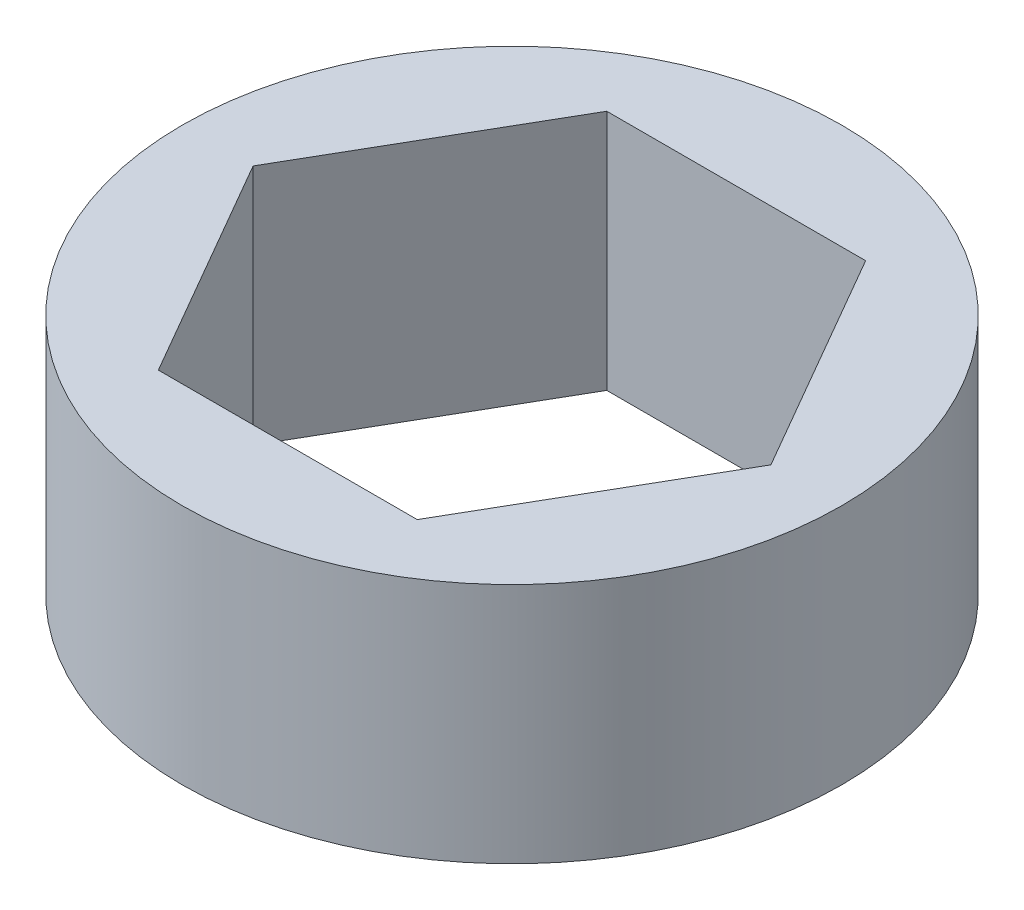
ISO-10303-21;
HEADER;
FILE_DESCRIPTION(('STEP AP214'),'2;1');
FILE_NAME('part.step','',(''),(''),'','','');
FILE_SCHEMA(('AUTOMOTIVE_DESIGN { 1 0 10303 214 1 1 1 1 }'));
ENDSEC;
DATA;
#1=APPLICATION_CONTEXT('core data for automotive mechanical design processes');
#2=APPLICATION_PROTOCOL_DEFINITION('international standard','automotive_design',2000,#1);
#3=PRODUCT_CONTEXT('',#1,'mechanical');
#4=PRODUCT('Part','Part','',(#3));
#5=PRODUCT_RELATED_PRODUCT_CATEGORY('part','',(#4));
#6=PRODUCT_DEFINITION_FORMATION('','',#4);
#7=PRODUCT_DEFINITION_CONTEXT('part definition',#1,'design');
#8=PRODUCT_DEFINITION('design','',#6,#7);
#9=PRODUCT_DEFINITION_SHAPE('','',#8);
#10=(LENGTH_UNIT() NAMED_UNIT(*) SI_UNIT(.MILLI.,.METRE.));
#11=(NAMED_UNIT(*) PLANE_ANGLE_UNIT() SI_UNIT($,.RADIAN.));
#12=(NAMED_UNIT(*) SI_UNIT($,.STERADIAN.) SOLID_ANGLE_UNIT());
#13=UNCERTAINTY_MEASURE_WITH_UNIT(LENGTH_MEASURE(1.E-05),#10,'distance_accuracy_value','');
#14=(GEOMETRIC_REPRESENTATION_CONTEXT(3) GLOBAL_UNCERTAINTY_ASSIGNED_CONTEXT((#13)) GLOBAL_UNIT_ASSIGNED_CONTEXT((#10,
#11,#12)) REPRESENTATION_CONTEXT('',''));
#15=CARTESIAN_POINT('',(0.,0.,0.));
#16=DIRECTION('',(0.,0.,1.));
#17=DIRECTION('',(1.,0.,0.));
#18=AXIS2_PLACEMENT_3D('',#15,#16,#17);
#19=CARTESIAN_POINT('',(0.,63.5,0.));
#20=DIRECTION('',(0.,-1.,0.));
#21=DIRECTION('',(0.,0.,-1.));
#22=AXIS2_PLACEMENT_3D('',#19,#20,#21);
#23=CYLINDRICAL_SURFACE('',#22,9.525);
#24=CARTESIAN_POINT('',(0.,0.,0.));
#25=DIRECTION('',(0.,1.,0.));
#26=DIRECTION('',(0.,0.,1.));
#27=AXIS2_PLACEMENT_3D('',#24,#25,#26);
#28=CIRCLE('',#27,9.525);
#29=CARTESIAN_POINT('',(0.,0.,9.525));
#30=VERTEX_POINT('',#29);
#31=EDGE_CURVE('E53',#30,#30,#28,.T.);
#32=ORIENTED_EDGE('',*,*,#31,.T.);
#33=EDGE_LOOP('',(#32));
#34=FACE_BOUND('',#33,.T.);
#35=CARTESIAN_POINT('',(0.,6.985,0.));
#36=DIRECTION('',(0.,1.,0.));
#37=DIRECTION('',(0.,0.,1.));
#38=AXIS2_PLACEMENT_3D('',#35,#36,#37);
#39=CIRCLE('',#38,9.525);
#40=CARTESIAN_POINT('',(0.,6.985,9.525));
#41=VERTEX_POINT('',#40);
#42=EDGE_CURVE('E109',#41,#41,#39,.F.);
#43=ORIENTED_EDGE('',*,*,#42,.T.);
#44=EDGE_LOOP('',(#43));
#45=FACE_BOUND('',#44,.T.);
#46=ADVANCED_FACE('F45',(#34,#45),#23,.T.);
#47=CARTESIAN_POINT('',(3.73949769354128,63.5,6.47699999999996));
#48=DIRECTION('',(-0.866025403784441,0.,-0.499999999999995));
#49=DIRECTION('',(-0.499999999999995,0.,0.866025403784442));
#50=AXIS2_PLACEMENT_3D('',#47,#48,#49);
#51=PLANE('',#50);
#52=DIRECTION('',(0.,-1.,0.));
#53=VECTOR('',#52,1.);
#54=CARTESIAN_POINT('',(3.73949769354128,63.5,6.47699999999996));
#55=LINE('',#54,#53);
#56=CARTESIAN_POINT('',(3.73949769354128,6.985,6.47699999999996));
#57=VERTEX_POINT('',#56);
#58=CARTESIAN_POINT('',(3.73949769354128,0.,6.47699999999996));
#59=VERTEX_POINT('',#58);
#60=EDGE_CURVE('E66',#57,#59,#55,.T.);
#61=ORIENTED_EDGE('',*,*,#60,.F.);
#62=DIRECTION('',(0.499999999999995,0.,-0.866025403784442));
#63=VECTOR('',#62,1.);
#64=CARTESIAN_POINT('',(3.73949769354128,6.985,6.47699999999996));
#65=LINE('',#64,#63);
#66=CARTESIAN_POINT('',(7.47899538708242,6.985,0.));
#67=VERTEX_POINT('',#66);
#68=EDGE_CURVE('E60',#57,#67,#65,.T.);
#69=ORIENTED_EDGE('',*,*,#68,.T.);
#70=DIRECTION('',(0.,-1.,0.));
#71=VECTOR('',#70,1.);
#72=CARTESIAN_POINT('',(7.47899538708242,63.5,0.));
#73=LINE('',#72,#71);
#74=CARTESIAN_POINT('',(7.47899538708242,0.,0.));
#75=VERTEX_POINT('',#74);
#76=EDGE_CURVE('E129',#67,#75,#73,.T.);
#77=ORIENTED_EDGE('',*,*,#76,.T.);
#78=DIRECTION('',(0.499999999999995,0.,-0.866025403784441));
#79=VECTOR('',#78,1.);
#80=CARTESIAN_POINT('',(3.73949769354128,0.,6.47699999999996));
#81=LINE('',#80,#79);
#82=EDGE_CURVE('E142',#59,#75,#81,.T.);
#83=ORIENTED_EDGE('',*,*,#82,.F.);
#84=EDGE_LOOP('',(#61,#69,#77,#83));
#85=FACE_BOUND('',#84,.T.);
#86=ADVANCED_FACE('F193',(#85),#51,.T.);
#87=CARTESIAN_POINT('',(7.47899538708242,63.5,0.));
#88=DIRECTION('',(-0.866025403784438,0.,0.500000000000001));
#89=DIRECTION('',(0.500000000000001,0.,0.866025403784438));
#90=AXIS2_PLACEMENT_3D('',#87,#88,#89);
#91=PLANE('',#90);
#92=ORIENTED_EDGE('',*,*,#76,.F.);
#93=DIRECTION('',(-0.500000000000001,0.,-0.866025403784438));
#94=VECTOR('',#93,1.);
#95=CARTESIAN_POINT('',(7.47899538708242,6.985,0.));
#96=LINE('',#95,#94);
#97=CARTESIAN_POINT('',(3.73949769354119,6.985,-6.47700000000001));
#98=VERTEX_POINT('',#97);
#99=EDGE_CURVE('E153',#67,#98,#96,.T.);
#100=ORIENTED_EDGE('',*,*,#99,.T.);
#101=DIRECTION('',(0.,-1.,0.));
#102=VECTOR('',#101,1.);
#103=CARTESIAN_POINT('',(3.73949769354119,63.5,-6.47700000000001));
#104=LINE('',#103,#102);
#105=CARTESIAN_POINT('',(3.73949769354119,0.,-6.47700000000001));
#106=VERTEX_POINT('',#105);
#107=EDGE_CURVE('E126',#98,#106,#104,.T.);
#108=ORIENTED_EDGE('',*,*,#107,.T.);
#109=DIRECTION('',(-0.500000000000001,0.,-0.866025403784438));
#110=VECTOR('',#109,1.);
#111=CARTESIAN_POINT('',(7.47899538708242,0.,0.));
#112=LINE('',#111,#110);
#113=EDGE_CURVE('E145',#75,#106,#112,.T.);
#114=ORIENTED_EDGE('',*,*,#113,.F.);
#115=EDGE_LOOP('',(#92,#100,#108,#114));
#116=FACE_BOUND('',#115,.T.);
#117=ADVANCED_FACE('F183',(#116),#91,.T.);
#118=CARTESIAN_POINT('',(3.73949769354119,63.5,-6.47700000000001));
#119=DIRECTION('',(0.,0.,1.));
#120=DIRECTION('',(1.,0.,0.));
#121=AXIS2_PLACEMENT_3D('',#118,#119,#120);
#122=PLANE('',#121);
#123=ORIENTED_EDGE('',*,*,#107,.F.);
#124=DIRECTION('',(-1.,0.,0.));
#125=VECTOR('',#124,1.);
#126=CARTESIAN_POINT('',(3.73949769354119,6.985,-6.47700000000001));
#127=LINE('',#126,#125);
#128=CARTESIAN_POINT('',(-3.73949769354124,6.985,-6.47699999999999));
#129=VERTEX_POINT('',#128);
#130=EDGE_CURVE('E173',#98,#129,#127,.T.);
#131=ORIENTED_EDGE('',*,*,#130,.T.);
#132=DIRECTION('',(0.,-1.,0.));
#133=VECTOR('',#132,1.);
#134=CARTESIAN_POINT('',(-3.73949769354124,63.5,-6.47699999999999));
#135=LINE('',#134,#133);
#136=CARTESIAN_POINT('',(-3.73949769354124,0.,-6.47699999999999));
#137=VERTEX_POINT('',#136);
#138=EDGE_CURVE('E119',#129,#137,#135,.T.);
#139=ORIENTED_EDGE('',*,*,#138,.T.);
#140=DIRECTION('',(-1.,0.,0.));
#141=VECTOR('',#140,1.);
#142=CARTESIAN_POINT('',(3.73949769354119,0.,-6.47700000000001));
#143=LINE('',#142,#141);
#144=EDGE_CURVE('E151',#106,#137,#143,.T.);
#145=ORIENTED_EDGE('',*,*,#144,.F.);
#146=EDGE_LOOP('',(#123,#131,#139,#145));
#147=FACE_BOUND('',#146,.T.);
#148=ADVANCED_FACE('F185',(#147),#122,.T.);
#149=CARTESIAN_POINT('',(-3.73949769354124,63.5,-6.47699999999999));
#150=DIRECTION('',(0.866025403784442,0.,0.499999999999995));
#151=DIRECTION('',(0.499999999999995,0.,-0.866025403784442));
#152=AXIS2_PLACEMENT_3D('',#149,#150,#151);
#153=PLANE('',#152);
#154=ORIENTED_EDGE('',*,*,#138,.F.);
#155=DIRECTION('',(-0.499999999999995,0.,0.866025403784442));
#156=VECTOR('',#155,1.);
#157=CARTESIAN_POINT('',(-3.73949769354124,6.985,-6.47699999999999));
#158=LINE('',#157,#156);
#159=CARTESIAN_POINT('',(-7.47899538708242,6.985,0.));
#160=VERTEX_POINT('',#159);
#161=EDGE_CURVE('E108',#129,#160,#158,.T.);
#162=ORIENTED_EDGE('',*,*,#161,.T.);
#163=DIRECTION('',(0.,-1.,0.));
#164=VECTOR('',#163,1.);
#165=CARTESIAN_POINT('',(-7.47899538708242,63.5,0.));
#166=LINE('',#165,#164);
#167=CARTESIAN_POINT('',(-7.47899538708242,0.,0.));
#168=VERTEX_POINT('',#167);
#169=EDGE_CURVE('E106',#160,#168,#166,.T.);
#170=ORIENTED_EDGE('',*,*,#169,.T.);
#171=DIRECTION('',(-0.499999999999995,0.,0.866025403784442));
#172=VECTOR('',#171,1.);
#173=CARTESIAN_POINT('',(-3.73949769354124,0.,-6.47699999999999));
#174=LINE('',#173,#172);
#175=EDGE_CURVE('E159',#137,#168,#174,.T.);
#176=ORIENTED_EDGE('',*,*,#175,.F.);
#177=EDGE_LOOP('',(#154,#162,#170,#176));
#178=FACE_BOUND('',#177,.T.);
#179=ADVANCED_FACE('F170',(#178),#153,.T.);
#180=CARTESIAN_POINT('',(-7.47899538708242,63.5,0.));
#181=DIRECTION('',(0.866025403784435,0.,-0.500000000000007));
#182=DIRECTION('',(-0.500000000000007,0.,-0.866025403784435));
#183=AXIS2_PLACEMENT_3D('',#180,#181,#182);
#184=PLANE('',#183);
#185=ORIENTED_EDGE('',*,*,#169,.F.);
#186=DIRECTION('',(0.500000000000007,0.,0.866025403784435));
#187=VECTOR('',#186,1.);
#188=CARTESIAN_POINT('',(-7.47899538708242,6.985,0.));
#189=LINE('',#188,#187);
#190=CARTESIAN_POINT('',(-3.73949769354115,6.985,6.47700000000004));
#191=VERTEX_POINT('',#190);
#192=EDGE_CURVE('E98',#160,#191,#189,.T.);
#193=ORIENTED_EDGE('',*,*,#192,.T.);
#194=DIRECTION('',(0.,-1.,0.));
#195=VECTOR('',#194,1.);
#196=CARTESIAN_POINT('',(-3.73949769354115,63.5,6.47700000000004));
#197=LINE('',#196,#195);
#198=CARTESIAN_POINT('',(-3.73949769354115,0.,6.47700000000004));
#199=VERTEX_POINT('',#198);
#200=EDGE_CURVE('E105',#191,#199,#197,.T.);
#201=ORIENTED_EDGE('',*,*,#200,.T.);
#202=DIRECTION('',(0.500000000000007,0.,0.866025403784435));
#203=VECTOR('',#202,1.);
#204=CARTESIAN_POINT('',(-7.47899538708242,0.,0.));
#205=LINE('',#204,#203);
#206=EDGE_CURVE('E163',#168,#199,#205,.T.);
#207=ORIENTED_EDGE('',*,*,#206,.F.);
#208=EDGE_LOOP('',(#185,#193,#201,#207));
#209=FACE_BOUND('',#208,.T.);
#210=ADVANCED_FACE('F103',(#209),#184,.T.);
#211=CARTESIAN_POINT('',(-3.73949769354115,63.5,6.47700000000004));
#212=DIRECTION('',(0.,0.,-1.));
#213=DIRECTION('',(-1.,0.,0.));
#214=AXIS2_PLACEMENT_3D('',#211,#212,#213);
#215=PLANE('',#214);
#216=ORIENTED_EDGE('',*,*,#200,.F.);
#217=DIRECTION('',(1.,0.,0.));
#218=VECTOR('',#217,1.);
#219=CARTESIAN_POINT('',(-3.73949769354115,6.985,6.47700000000004));
#220=LINE('',#219,#218);
#221=EDGE_CURVE('E12',#191,#57,#220,.T.);
#222=ORIENTED_EDGE('',*,*,#221,.T.);
#223=ORIENTED_EDGE('',*,*,#60,.T.);
#224=DIRECTION('',(1.,0.,0.));
#225=VECTOR('',#224,1.);
#226=CARTESIAN_POINT('',(-3.73949769354115,0.,6.47700000000004));
#227=LINE('',#226,#225);
#228=EDGE_CURVE('E113',#199,#59,#227,.T.);
#229=ORIENTED_EDGE('',*,*,#228,.F.);
#230=EDGE_LOOP('',(#216,#222,#223,#229));
#231=FACE_BOUND('',#230,.T.);
#232=ADVANCED_FACE('F111',(#231),#215,.T.);
#233=CARTESIAN_POINT('',(0.,0.,0.));
#234=DIRECTION('',(0.,1.,0.));
#235=DIRECTION('',(0.,0.,1.));
#236=AXIS2_PLACEMENT_3D('',#233,#234,#235);
#237=PLANE('',#236);
#238=ORIENTED_EDGE('',*,*,#31,.F.);
#239=EDGE_LOOP('',(#238));
#240=FACE_BOUND('',#239,.T.);
#241=ORIENTED_EDGE('',*,*,#82,.T.);
#242=ORIENTED_EDGE('',*,*,#113,.T.);
#243=ORIENTED_EDGE('',*,*,#144,.T.);
#244=ORIENTED_EDGE('',*,*,#175,.T.);
#245=ORIENTED_EDGE('',*,*,#206,.T.);
#246=ORIENTED_EDGE('',*,*,#228,.T.);
#247=EDGE_LOOP('',(#241,#242,#243,#244,#245,#246));
#248=FACE_BOUND('',#247,.T.);
#249=ADVANCED_FACE('F137',(#240,#248),#237,.F.);
#250=CARTESIAN_POINT('',(0.,6.985,0.));
#251=DIRECTION('',(0.,1.,0.));
#252=DIRECTION('',(0.,0.,1.));
#253=AXIS2_PLACEMENT_3D('',#250,#251,#252);
#254=PLANE('',#253);
#255=ORIENTED_EDGE('',*,*,#221,.F.);
#256=ORIENTED_EDGE('',*,*,#192,.F.);
#257=ORIENTED_EDGE('',*,*,#161,.F.);
#258=ORIENTED_EDGE('',*,*,#130,.F.);
#259=ORIENTED_EDGE('',*,*,#99,.F.);
#260=ORIENTED_EDGE('',*,*,#68,.F.);
#261=EDGE_LOOP('',(#255,#256,#257,#258,#259,#260));
#262=FACE_BOUND('',#261,.T.);
#263=ORIENTED_EDGE('',*,*,#42,.F.);
#264=EDGE_LOOP('',(#263));
#265=FACE_BOUND('',#264,.T.);
#266=ADVANCED_FACE('F96',(#262,#265),#254,.T.);
#267=CLOSED_SHELL('',(#46,#86,#117,#148,#179,#210,#232,#249,#266));
#268=MANIFOLD_SOLID_BREP('B2',#267);
#269=ADVANCED_BREP_SHAPE_REPRESENTATION('',(#18,#268),#14);
#270=SHAPE_DEFINITION_REPRESENTATION(#9,#269);
ENDSEC;
END-ISO-10303-21;
